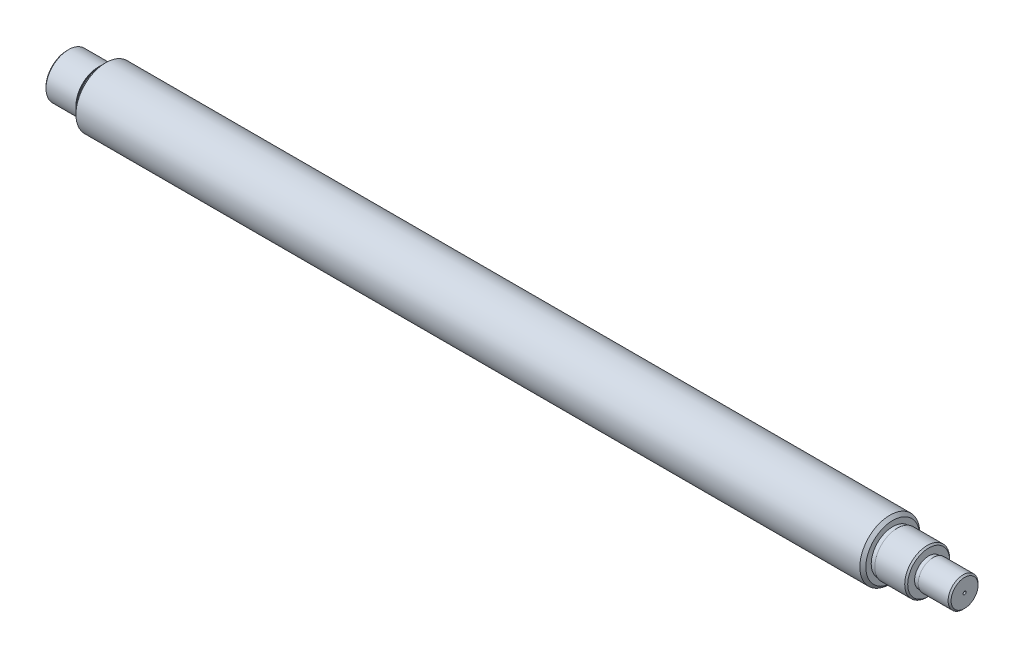
ISO-10303-21;
HEADER;
FILE_DESCRIPTION(('STEP AP214'),'2;1');
FILE_NAME('part.step','',(''),(''),'','','');
FILE_SCHEMA(('AUTOMOTIVE_DESIGN { 1 0 10303 214 1 1 1 1 }'));
ENDSEC;
DATA;
#1=APPLICATION_CONTEXT('core data for automotive mechanical design processes');
#2=APPLICATION_PROTOCOL_DEFINITION('international standard','automotive_design',2000,#1);
#3=PRODUCT_CONTEXT('',#1,'mechanical');
#4=PRODUCT('Part','Part','',(#3));
#5=PRODUCT_RELATED_PRODUCT_CATEGORY('part','',(#4));
#6=PRODUCT_DEFINITION_FORMATION('','',#4);
#7=PRODUCT_DEFINITION_CONTEXT('part definition',#1,'design');
#8=PRODUCT_DEFINITION('design','',#6,#7);
#9=PRODUCT_DEFINITION_SHAPE('','',#8);
#10=(LENGTH_UNIT() NAMED_UNIT(*) SI_UNIT(.MILLI.,.METRE.));
#11=(NAMED_UNIT(*) PLANE_ANGLE_UNIT() SI_UNIT($,.RADIAN.));
#12=(NAMED_UNIT(*) SI_UNIT($,.STERADIAN.) SOLID_ANGLE_UNIT());
#13=UNCERTAINTY_MEASURE_WITH_UNIT(LENGTH_MEASURE(1.E-05),#10,'distance_accuracy_value','');
#14=(GEOMETRIC_REPRESENTATION_CONTEXT(3) GLOBAL_UNCERTAINTY_ASSIGNED_CONTEXT((#13)) GLOBAL_UNIT_ASSIGNED_CONTEXT((#10,
#11,#12)) REPRESENTATION_CONTEXT('',''));
#15=CARTESIAN_POINT('',(0.,0.,0.));
#16=DIRECTION('',(0.,0.,1.));
#17=DIRECTION('',(1.,0.,0.));
#18=AXIS2_PLACEMENT_3D('',#15,#16,#17);
#19=CARTESIAN_POINT('',(13.,0.,0.));
#20=DIRECTION('',(1.,0.,0.));
#21=DIRECTION('',(0.,0.,-1.));
#22=AXIS2_PLACEMENT_3D('',#19,#20,#21);
#23=CONICAL_SURFACE('',#22,10.,0.785398163397455);
#24=CARTESIAN_POINT('',(12.,0.,0.));
#25=DIRECTION('',(-1.,0.,0.));
#26=DIRECTION('',(0.,0.,1.));
#27=AXIS2_PLACEMENT_3D('',#24,#25,#26);
#28=CIRCLE('',#27,9.);
#29=CARTESIAN_POINT('',(12.,0.,9.));
#30=VERTEX_POINT('',#29);
#31=EDGE_CURVE('E78',#30,#30,#28,.T.);
#32=ORIENTED_EDGE('',*,*,#31,.F.);
#33=EDGE_LOOP('',(#32));
#34=FACE_BOUND('',#33,.T.);
#35=CARTESIAN_POINT('',(13.,0.,0.));
#36=DIRECTION('',(-1.,0.,0.));
#37=DIRECTION('',(0.,0.,1.));
#38=AXIS2_PLACEMENT_3D('',#35,#36,#37);
#39=CIRCLE('',#38,10.);
#40=CARTESIAN_POINT('',(13.,0.,10.));
#41=VERTEX_POINT('',#40);
#42=EDGE_CURVE('E63',#41,#41,#39,.T.);
#43=ORIENTED_EDGE('',*,*,#42,.T.);
#44=EDGE_LOOP('',(#43));
#45=FACE_BOUND('',#44,.T.);
#46=ADVANCED_FACE('F35',(#34,#45),#23,.T.);
#47=CARTESIAN_POINT('',(12.,7.5,0.));
#48=DIRECTION('',(1.,0.,0.));
#49=DIRECTION('',(0.,0.,-1.));
#50=AXIS2_PLACEMENT_3D('',#47,#48,#49);
#51=PLANE('',#50);
#52=ORIENTED_EDGE('',*,*,#31,.T.);
#53=EDGE_LOOP('',(#52));
#54=FACE_BOUND('',#53,.T.);
#55=CARTESIAN_POINT('',(12.,0.,0.));
#56=DIRECTION('',(-1.,0.,0.));
#57=DIRECTION('',(0.,0.,1.));
#58=AXIS2_PLACEMENT_3D('',#55,#56,#57);
#59=CIRCLE('',#58,7.2);
#60=CARTESIAN_POINT('',(12.,0.,7.2));
#61=VERTEX_POINT('',#60);
#62=EDGE_CURVE('E66',#61,#61,#59,.T.);
#63=ORIENTED_EDGE('',*,*,#62,.F.);
#64=EDGE_LOOP('',(#63));
#65=FACE_BOUND('',#64,.T.);
#66=ADVANCED_FACE('F112',(#54,#65),#51,.F.);
#67=CARTESIAN_POINT('',(276.,9.,0.));
#68=DIRECTION('',(-1.,0.,0.));
#69=DIRECTION('',(0.,0.,1.));
#70=AXIS2_PLACEMENT_3D('',#67,#68,#69);
#71=PLANE('',#70);
#72=CARTESIAN_POINT('',(276.,0.,0.));
#73=DIRECTION('',(-1.,0.,0.));
#74=DIRECTION('',(0.,0.,1.));
#75=AXIS2_PLACEMENT_3D('',#72,#73,#74);
#76=CIRCLE('',#75,9.);
#77=CARTESIAN_POINT('',(276.,0.,9.));
#78=VERTEX_POINT('',#77);
#79=EDGE_CURVE('E75',#78,#78,#76,.T.);
#80=ORIENTED_EDGE('',*,*,#79,.F.);
#81=EDGE_LOOP('',(#80));
#82=FACE_BOUND('',#81,.T.);
#83=CARTESIAN_POINT('',(276.,0.,0.));
#84=DIRECTION('',(-1.,0.,0.));
#85=DIRECTION('',(0.,0.,1.));
#86=AXIS2_PLACEMENT_3D('',#83,#84,#85);
#87=CIRCLE('',#86,7.2);
#88=CARTESIAN_POINT('',(276.,0.,7.2));
#89=VERTEX_POINT('',#88);
#90=EDGE_CURVE('E155',#89,#89,#87,.T.);
#91=ORIENTED_EDGE('',*,*,#90,.T.);
#92=EDGE_LOOP('',(#91));
#93=FACE_BOUND('',#92,.T.);
#94=ADVANCED_FACE('F118',(#82,#93),#71,.F.);
#95=CARTESIAN_POINT('',(276.,0.,0.));
#96=DIRECTION('',(-1.,0.,0.));
#97=DIRECTION('',(0.,0.,1.));
#98=AXIS2_PLACEMENT_3D('',#95,#96,#97);
#99=CONICAL_SURFACE('',#98,9.,0.785398163397448);
#100=CARTESIAN_POINT('',(275.,0.,0.));
#101=DIRECTION('',(-1.,0.,0.));
#102=DIRECTION('',(0.,0.,1.));
#103=AXIS2_PLACEMENT_3D('',#100,#101,#102);
#104=CIRCLE('',#103,10.);
#105=CARTESIAN_POINT('',(275.,0.,10.));
#106=VERTEX_POINT('',#105);
#107=EDGE_CURVE('E72',#106,#106,#104,.T.);
#108=ORIENTED_EDGE('',*,*,#107,.F.);
#109=EDGE_LOOP('',(#108));
#110=FACE_BOUND('',#109,.T.);
#111=ORIENTED_EDGE('',*,*,#79,.T.);
#112=EDGE_LOOP('',(#111));
#113=FACE_BOUND('',#112,.T.);
#114=ADVANCED_FACE('F186',(#110,#113),#99,.T.);
#115=CARTESIAN_POINT('',(0.,0.,0.));
#116=DIRECTION('',(-1.,0.,0.));
#117=DIRECTION('',(0.,0.,1.));
#118=AXIS2_PLACEMENT_3D('',#115,#116,#117);
#119=CYLINDRICAL_SURFACE('',#118,10.);
#120=ORIENTED_EDGE('',*,*,#42,.F.);
#121=EDGE_LOOP('',(#120));
#122=FACE_BOUND('',#121,.T.);
#123=ORIENTED_EDGE('',*,*,#107,.T.);
#124=EDGE_LOOP('',(#123));
#125=FACE_BOUND('',#124,.T.);
#126=ADVANCED_FACE('F179',(#122,#125),#119,.T.);
#127=CARTESIAN_POINT('',(10.5,7.5,0.));
#128=DIRECTION('',(1.,0.,0.));
#129=DIRECTION('',(0.,0.,-1.));
#130=AXIS2_PLACEMENT_3D('',#127,#128,#129);
#131=PLANE('',#130);
#132=CARTESIAN_POINT('',(10.5,0.,0.));
#133=DIRECTION('',(-1.,0.,0.));
#134=DIRECTION('',(0.,0.,1.));
#135=AXIS2_PLACEMENT_3D('',#132,#133,#134);
#136=CIRCLE('',#135,7.2);
#137=CARTESIAN_POINT('',(10.5,0.,7.2));
#138=VERTEX_POINT('',#137);
#139=EDGE_CURVE('E60',#138,#138,#136,.T.);
#140=ORIENTED_EDGE('',*,*,#139,.T.);
#141=EDGE_LOOP('',(#140));
#142=FACE_BOUND('',#141,.T.);
#143=CARTESIAN_POINT('',(10.5,0.,0.));
#144=DIRECTION('',(-1.,0.,0.));
#145=DIRECTION('',(0.,0.,1.));
#146=AXIS2_PLACEMENT_3D('',#143,#144,#145);
#147=CIRCLE('',#146,7.5);
#148=CARTESIAN_POINT('',(10.5,0.,7.5));
#149=VERTEX_POINT('',#148);
#150=EDGE_CURVE('E164',#149,#149,#147,.T.);
#151=ORIENTED_EDGE('',*,*,#150,.F.);
#152=EDGE_LOOP('',(#151));
#153=FACE_BOUND('',#152,.T.);
#154=ADVANCED_FACE('F173',(#142,#153),#131,.T.);
#155=CARTESIAN_POINT('',(0.,0.,0.));
#156=DIRECTION('',(-1.,0.,0.));
#157=DIRECTION('',(0.,0.,1.));
#158=AXIS2_PLACEMENT_3D('',#155,#156,#157);
#159=CYLINDRICAL_SURFACE('',#158,7.2);
#160=ORIENTED_EDGE('',*,*,#62,.T.);
#161=EDGE_LOOP('',(#160));
#162=FACE_BOUND('',#161,.T.);
#163=ORIENTED_EDGE('',*,*,#139,.F.);
#164=EDGE_LOOP('',(#163));
#165=FACE_BOUND('',#164,.T.);
#166=ADVANCED_FACE('F169',(#162,#165),#159,.T.);
#167=CARTESIAN_POINT('',(0.5,0.,0.));
#168=DIRECTION('',(-1.,0.,0.));
#169=DIRECTION('',(0.,0.,1.));
#170=AXIS2_PLACEMENT_3D('',#167,#168,#169);
#171=CONICAL_SURFACE('',#170,0.,0.785398163397448);
#172=CARTESIAN_POINT('',(0.,0.,0.));
#173=DIRECTION('',(-1.,0.,0.));
#174=DIRECTION('',(0.,0.,1.));
#175=AXIS2_PLACEMENT_3D('',#172,#173,#174);
#176=CIRCLE('',#175,0.5);
#177=CARTESIAN_POINT('',(0.,0.,0.5));
#178=VERTEX_POINT('',#177);
#179=EDGE_CURVE('E59',#178,#178,#176,.T.);
#180=ORIENTED_EDGE('',*,*,#179,.T.);
#181=EDGE_LOOP('',(#180));
#182=FACE_BOUND('',#181,.T.);
#183=CARTESIAN_POINT('',(0.5,0.,0.));
#184=VERTEX_POINT('',#183);
#185=VERTEX_LOOP('',#184);
#186=FACE_BOUND('',#185,.T.);
#187=ADVANCED_FACE('F108',(#182,#186),#171,.F.);
#188=CARTESIAN_POINT('',(0.,0.,0.));
#189=DIRECTION('',(1.,0.,0.));
#190=DIRECTION('',(0.,0.,-1.));
#191=AXIS2_PLACEMENT_3D('',#188,#189,#190);
#192=PLANE('',#191);
#193=CARTESIAN_POINT('',(0.,0.,0.));
#194=DIRECTION('',(1.,0.,0.));
#195=DIRECTION('',(0.,0.,-1.));
#196=AXIS2_PLACEMENT_3D('',#193,#194,#195);
#197=CIRCLE('',#196,7.00000000000003);
#198=CARTESIAN_POINT('',(0.,0.,-7.00000000000003));
#199=VERTEX_POINT('',#198);
#200=EDGE_CURVE('E43',#199,#199,#197,.F.);
#201=ORIENTED_EDGE('',*,*,#200,.T.);
#202=EDGE_LOOP('',(#201));
#203=FACE_BOUND('',#202,.T.);
#204=ORIENTED_EDGE('',*,*,#179,.F.);
#205=EDGE_LOOP('',(#204));
#206=FACE_BOUND('',#205,.T.);
#207=ADVANCED_FACE('F95',(#203,#206),#192,.F.);
#208=CARTESIAN_POINT('',(0.,0.,0.));
#209=DIRECTION('',(1.,0.,0.));
#210=DIRECTION('',(0.,0.,-1.));
#211=AXIS2_PLACEMENT_3D('',#208,#209,#210);
#212=CONICAL_SURFACE('',#211,7.00000000000003,0.785398163397451);
#213=CARTESIAN_POINT('',(0.499999999999964,0.,0.));
#214=DIRECTION('',(1.,0.,0.));
#215=DIRECTION('',(0.,0.,-1.));
#216=AXIS2_PLACEMENT_3D('',#213,#214,#215);
#217=CIRCLE('',#216,7.5);
#218=CARTESIAN_POINT('',(0.499999999999964,0.,-7.5));
#219=VERTEX_POINT('',#218);
#220=EDGE_CURVE('E11',#219,#219,#217,.T.);
#221=ORIENTED_EDGE('',*,*,#220,.F.);
#222=EDGE_LOOP('',(#221));
#223=FACE_BOUND('',#222,.T.);
#224=ORIENTED_EDGE('',*,*,#200,.F.);
#225=EDGE_LOOP('',(#224));
#226=FACE_BOUND('',#225,.T.);
#227=ADVANCED_FACE('F37',(#223,#226),#212,.T.);
#228=CARTESIAN_POINT('',(0.,0.,0.));
#229=DIRECTION('',(-1.,0.,0.));
#230=DIRECTION('',(0.,0.,1.));
#231=AXIS2_PLACEMENT_3D('',#228,#229,#230);
#232=CYLINDRICAL_SURFACE('',#231,7.5);
#233=ORIENTED_EDGE('',*,*,#220,.T.);
#234=EDGE_LOOP('',(#233));
#235=FACE_BOUND('',#234,.T.);
#236=ORIENTED_EDGE('',*,*,#150,.T.);
#237=EDGE_LOOP('',(#236));
#238=FACE_BOUND('',#237,.T.);
#239=ADVANCED_FACE('F99',(#235,#238),#232,.T.);
#240=CARTESIAN_POINT('',(0.,0.,0.));
#241=DIRECTION('',(-1.,0.,0.));
#242=DIRECTION('',(0.,0.,1.));
#243=AXIS2_PLACEMENT_3D('',#240,#241,#242);
#244=CYLINDRICAL_SURFACE('',#243,7.2);
#245=CARTESIAN_POINT('',(277.5,0.,0.));
#246=DIRECTION('',(-1.,0.,0.));
#247=DIRECTION('',(0.,0.,1.));
#248=AXIS2_PLACEMENT_3D('',#245,#246,#247);
#249=CIRCLE('',#248,7.2);
#250=CARTESIAN_POINT('',(277.5,0.,7.2));
#251=VERTEX_POINT('',#250);
#252=EDGE_CURVE('E151',#251,#251,#249,.T.);
#253=ORIENTED_EDGE('',*,*,#252,.T.);
#254=EDGE_LOOP('',(#253));
#255=FACE_BOUND('',#254,.T.);
#256=ORIENTED_EDGE('',*,*,#90,.F.);
#257=EDGE_LOOP('',(#256));
#258=FACE_BOUND('',#257,.T.);
#259=ADVANCED_FACE('F105',(#255,#258),#244,.T.);
#260=CARTESIAN_POINT('',(277.5,7.5,0.));
#261=DIRECTION('',(-1.,0.,0.));
#262=DIRECTION('',(0.,0.,1.));
#263=AXIS2_PLACEMENT_3D('',#260,#261,#262);
#264=PLANE('',#263);
#265=CARTESIAN_POINT('',(277.5,0.,0.));
#266=DIRECTION('',(-1.,0.,0.));
#267=DIRECTION('',(0.,0.,1.));
#268=AXIS2_PLACEMENT_3D('',#265,#266,#267);
#269=CIRCLE('',#268,7.5);
#270=CARTESIAN_POINT('',(277.5,0.,7.5));
#271=VERTEX_POINT('',#270);
#272=EDGE_CURVE('E149',#271,#271,#269,.T.);
#273=ORIENTED_EDGE('',*,*,#272,.T.);
#274=EDGE_LOOP('',(#273));
#275=FACE_BOUND('',#274,.T.);
#276=ORIENTED_EDGE('',*,*,#252,.F.);
#277=EDGE_LOOP('',(#276));
#278=FACE_BOUND('',#277,.T.);
#279=ADVANCED_FACE('F140',(#275,#278),#264,.T.);
#280=CARTESIAN_POINT('',(288.,7.5,0.));
#281=DIRECTION('',(-1.,0.,0.));
#282=DIRECTION('',(0.,0.,1.));
#283=AXIS2_PLACEMENT_3D('',#280,#281,#282);
#284=PLANE('',#283);
#285=CARTESIAN_POINT('',(288.,0.,0.));
#286=DIRECTION('',(-1.,0.,0.));
#287=DIRECTION('',(0.,0.,1.));
#288=AXIS2_PLACEMENT_3D('',#285,#286,#287);
#289=CIRCLE('',#288,6.99999999999998);
#290=CARTESIAN_POINT('',(288.,0.,6.99999999999998));
#291=VERTEX_POINT('',#290);
#292=EDGE_CURVE('E90',#291,#291,#289,.F.);
#293=ORIENTED_EDGE('',*,*,#292,.T.);
#294=EDGE_LOOP('',(#293));
#295=FACE_BOUND('',#294,.T.);
#296=CARTESIAN_POINT('',(288.,0.,0.));
#297=DIRECTION('',(-1.,0.,0.));
#298=DIRECTION('',(0.,0.,1.));
#299=AXIS2_PLACEMENT_3D('',#296,#297,#298);
#300=CIRCLE('',#299,4.7);
#301=CARTESIAN_POINT('',(288.,0.,4.7));
#302=VERTEX_POINT('',#301);
#303=EDGE_CURVE('E152',#302,#302,#300,.T.);
#304=ORIENTED_EDGE('',*,*,#303,.T.);
#305=EDGE_LOOP('',(#304));
#306=FACE_BOUND('',#305,.T.);
#307=ADVANCED_FACE('F131',(#295,#306),#284,.F.);
#308=CARTESIAN_POINT('',(287.5,0.,0.));
#309=DIRECTION('',(-1.,0.,0.));
#310=DIRECTION('',(0.,0.,1.));
#311=AXIS2_PLACEMENT_3D('',#308,#309,#310);
#312=CONICAL_SURFACE('',#311,7.5,0.78539816339747);
#313=ORIENTED_EDGE('',*,*,#292,.F.);
#314=EDGE_LOOP('',(#313));
#315=FACE_BOUND('',#314,.T.);
#316=CARTESIAN_POINT('',(287.5,0.,0.));
#317=DIRECTION('',(-1.,0.,0.));
#318=DIRECTION('',(0.,0.,1.));
#319=AXIS2_PLACEMENT_3D('',#316,#317,#318);
#320=CIRCLE('',#319,7.5);
#321=CARTESIAN_POINT('',(287.5,0.,7.5));
#322=VERTEX_POINT('',#321);
#323=EDGE_CURVE('E87',#322,#322,#320,.T.);
#324=ORIENTED_EDGE('',*,*,#323,.F.);
#325=EDGE_LOOP('',(#324));
#326=FACE_BOUND('',#325,.T.);
#327=ADVANCED_FACE('F128',(#315,#326),#312,.T.);
#328=CARTESIAN_POINT('',(0.,0.,0.));
#329=DIRECTION('',(-1.,0.,0.));
#330=DIRECTION('',(0.,0.,1.));
#331=AXIS2_PLACEMENT_3D('',#328,#329,#330);
#332=CYLINDRICAL_SURFACE('',#331,7.5);
#333=ORIENTED_EDGE('',*,*,#323,.T.);
#334=EDGE_LOOP('',(#333));
#335=FACE_BOUND('',#334,.T.);
#336=ORIENTED_EDGE('',*,*,#272,.F.);
#337=EDGE_LOOP('',(#336));
#338=FACE_BOUND('',#337,.T.);
#339=ADVANCED_FACE('F130',(#335,#338),#332,.T.);
#340=CARTESIAN_POINT('',(0.,0.,0.));
#341=DIRECTION('',(-1.,0.,0.));
#342=DIRECTION('',(0.,0.,1.));
#343=AXIS2_PLACEMENT_3D('',#340,#341,#342);
#344=CYLINDRICAL_SURFACE('',#343,4.7);
#345=CARTESIAN_POINT('',(289.5,0.,0.));
#346=DIRECTION('',(-1.,0.,0.));
#347=DIRECTION('',(0.,0.,1.));
#348=AXIS2_PLACEMENT_3D('',#345,#346,#347);
#349=CIRCLE('',#348,4.7);
#350=CARTESIAN_POINT('',(289.5,0.,4.7));
#351=VERTEX_POINT('',#350);
#352=EDGE_CURVE('E158',#351,#351,#349,.T.);
#353=ORIENTED_EDGE('',*,*,#352,.T.);
#354=EDGE_LOOP('',(#353));
#355=FACE_BOUND('',#354,.T.);
#356=ORIENTED_EDGE('',*,*,#303,.F.);
#357=EDGE_LOOP('',(#356));
#358=FACE_BOUND('',#357,.T.);
#359=ADVANCED_FACE('F137',(#355,#358),#344,.T.);
#360=CARTESIAN_POINT('',(289.5,5.,0.));
#361=DIRECTION('',(-1.,0.,0.));
#362=DIRECTION('',(0.,0.,1.));
#363=AXIS2_PLACEMENT_3D('',#360,#361,#362);
#364=PLANE('',#363);
#365=CARTESIAN_POINT('',(289.5,0.,0.));
#366=DIRECTION('',(-1.,0.,0.));
#367=DIRECTION('',(0.,0.,1.));
#368=AXIS2_PLACEMENT_3D('',#365,#366,#367);
#369=CIRCLE('',#368,5.);
#370=CARTESIAN_POINT('',(289.5,0.,5.));
#371=VERTEX_POINT('',#370);
#372=EDGE_CURVE('E213',#371,#371,#369,.T.);
#373=ORIENTED_EDGE('',*,*,#372,.T.);
#374=EDGE_LOOP('',(#373));
#375=FACE_BOUND('',#374,.T.);
#376=ORIENTED_EDGE('',*,*,#352,.F.);
#377=EDGE_LOOP('',(#376));
#378=FACE_BOUND('',#377,.T.);
#379=ADVANCED_FACE('F53',(#375,#378),#364,.T.);
#380=CARTESIAN_POINT('',(300.,0.,0.));
#381=DIRECTION('',(1.,0.,0.));
#382=DIRECTION('',(0.,0.,-1.));
#383=AXIS2_PLACEMENT_3D('',#380,#381,#382);
#384=CONICAL_SURFACE('',#383,0.5,0.785398163397448);
#385=CARTESIAN_POINT('',(299.5,0.,0.));
#386=VERTEX_POINT('',#385);
#387=VERTEX_LOOP('',#386);
#388=FACE_BOUND('',#387,.T.);
#389=CARTESIAN_POINT('',(300.,0.,0.));
#390=DIRECTION('',(-1.,0.,0.));
#391=DIRECTION('',(0.,0.,1.));
#392=AXIS2_PLACEMENT_3D('',#389,#390,#391);
#393=CIRCLE('',#392,0.5);
#394=CARTESIAN_POINT('',(300.,0.,0.5));
#395=VERTEX_POINT('',#394);
#396=EDGE_CURVE('E57',#395,#395,#393,.T.);
#397=ORIENTED_EDGE('',*,*,#396,.F.);
#398=EDGE_LOOP('',(#397));
#399=FACE_BOUND('',#398,.T.);
#400=ADVANCED_FACE('F49',(#388,#399),#384,.F.);
#401=CARTESIAN_POINT('',(300.,5.,0.));
#402=DIRECTION('',(-1.,0.,0.));
#403=DIRECTION('',(0.,0.,1.));
#404=AXIS2_PLACEMENT_3D('',#401,#402,#403);
#405=PLANE('',#404);
#406=CARTESIAN_POINT('',(300.,0.,0.));
#407=DIRECTION('',(-1.,0.,0.));
#408=DIRECTION('',(0.,0.,1.));
#409=AXIS2_PLACEMENT_3D('',#406,#407,#408);
#410=CIRCLE('',#409,4.5);
#411=CARTESIAN_POINT('',(300.,0.,4.5));
#412=VERTEX_POINT('',#411);
#413=EDGE_CURVE('E84',#412,#412,#410,.F.);
#414=ORIENTED_EDGE('',*,*,#413,.T.);
#415=EDGE_LOOP('',(#414));
#416=FACE_BOUND('',#415,.T.);
#417=ORIENTED_EDGE('',*,*,#396,.T.);
#418=EDGE_LOOP('',(#417));
#419=FACE_BOUND('',#418,.T.);
#420=ADVANCED_FACE('F52',(#416,#419),#405,.F.);
#421=CARTESIAN_POINT('',(299.5,0.,0.));
#422=DIRECTION('',(-1.,0.,0.));
#423=DIRECTION('',(0.,0.,1.));
#424=AXIS2_PLACEMENT_3D('',#421,#422,#423);
#425=CONICAL_SURFACE('',#424,5.,0.785398163397499);
#426=ORIENTED_EDGE('',*,*,#413,.F.);
#427=EDGE_LOOP('',(#426));
#428=FACE_BOUND('',#427,.T.);
#429=CARTESIAN_POINT('',(299.5,0.,0.));
#430=DIRECTION('',(-1.,0.,0.));
#431=DIRECTION('',(0.,0.,1.));
#432=AXIS2_PLACEMENT_3D('',#429,#430,#431);
#433=CIRCLE('',#432,5.);
#434=CARTESIAN_POINT('',(299.5,0.,5.));
#435=VERTEX_POINT('',#434);
#436=EDGE_CURVE('E81',#435,#435,#433,.T.);
#437=ORIENTED_EDGE('',*,*,#436,.F.);
#438=EDGE_LOOP('',(#437));
#439=FACE_BOUND('',#438,.T.);
#440=ADVANCED_FACE('F124',(#428,#439),#425,.T.);
#441=CARTESIAN_POINT('',(0.,0.,0.));
#442=DIRECTION('',(-1.,0.,0.));
#443=DIRECTION('',(0.,0.,1.));
#444=AXIS2_PLACEMENT_3D('',#441,#442,#443);
#445=CYLINDRICAL_SURFACE('',#444,5.);
#446=ORIENTED_EDGE('',*,*,#436,.T.);
#447=EDGE_LOOP('',(#446));
#448=FACE_BOUND('',#447,.T.);
#449=ORIENTED_EDGE('',*,*,#372,.F.);
#450=EDGE_LOOP('',(#449));
#451=FACE_BOUND('',#450,.T.);
#452=ADVANCED_FACE('F126',(#448,#451),#445,.T.);
#453=CLOSED_SHELL('',(#46,#66,#94,#114,#126,#154,#166,#187,#207,#227,#239,#259,#279,#307,#327,
#339,#359,#379,#400,#420,#440,#452));
#454=MANIFOLD_SOLID_BREP('B2',#453);
#455=ADVANCED_BREP_SHAPE_REPRESENTATION('',(#18,#454),#14);
#456=SHAPE_DEFINITION_REPRESENTATION(#9,#455);
ENDSEC;
END-ISO-10303-21;
